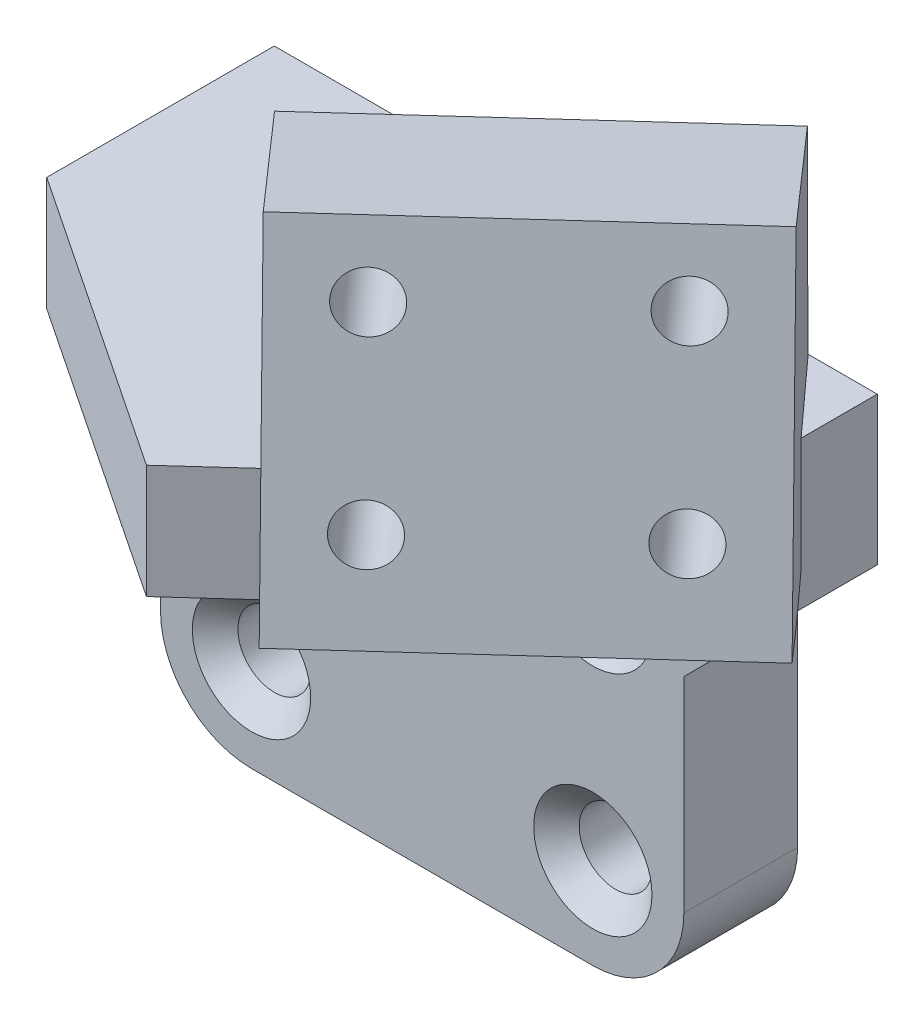
ISO-10303-21;
HEADER;
FILE_DESCRIPTION(('STEP AP214'),'2;1');
FILE_NAME('part.step','',(''),(''),'','','');
FILE_SCHEMA(('AUTOMOTIVE_DESIGN { 1 0 10303 214 1 1 1 1 }'));
ENDSEC;
DATA;
#1=APPLICATION_CONTEXT('core data for automotive mechanical design processes');
#2=APPLICATION_PROTOCOL_DEFINITION('international standard','automotive_design',2000,#1);
#3=PRODUCT_CONTEXT('',#1,'mechanical');
#4=PRODUCT('Part','Part','',(#3));
#5=PRODUCT_RELATED_PRODUCT_CATEGORY('part','',(#4));
#6=PRODUCT_DEFINITION_FORMATION('','',#4);
#7=PRODUCT_DEFINITION_CONTEXT('part definition',#1,'design');
#8=PRODUCT_DEFINITION('design','',#6,#7);
#9=PRODUCT_DEFINITION_SHAPE('','',#8);
#10=(LENGTH_UNIT() NAMED_UNIT(*) SI_UNIT(.MILLI.,.METRE.));
#11=(NAMED_UNIT(*) PLANE_ANGLE_UNIT() SI_UNIT($,.RADIAN.));
#12=(NAMED_UNIT(*) SI_UNIT($,.STERADIAN.) SOLID_ANGLE_UNIT());
#13=UNCERTAINTY_MEASURE_WITH_UNIT(LENGTH_MEASURE(1.E-05),#10,'distance_accuracy_value','');
#14=(GEOMETRIC_REPRESENTATION_CONTEXT(3) GLOBAL_UNCERTAINTY_ASSIGNED_CONTEXT((#13)) GLOBAL_UNIT_ASSIGNED_CONTEXT((#10,
#11,#12)) REPRESENTATION_CONTEXT('',''));
#15=CARTESIAN_POINT('',(0.,0.,0.));
#16=DIRECTION('',(0.,0.,1.));
#17=DIRECTION('',(1.,0.,0.));
#18=AXIS2_PLACEMENT_3D('',#15,#16,#17);
#19=CARTESIAN_POINT('',(0.,14.,0.));
#20=DIRECTION('',(0.,1.,0.));
#21=DIRECTION('',(0.,0.,1.));
#22=AXIS2_PLACEMENT_3D('',#19,#20,#21);
#23=PLANE('',#22);
#24=DIRECTION('',(-0.671979137980562,0.,-0.740570076440374));
#25=VECTOR('',#24,1.);
#26=CARTESIAN_POINT('',(-5.71821437489418,14.,5.18859847119252));
#27=LINE('',#26,#25);
#28=CARTESIAN_POINT('',(4.36147269481426,14.,16.2971496177981));
#29=VERTEX_POINT('',#28);
#30=CARTESIAN_POINT('',(-2.02232911600108,14.,9.2617338916146));
#31=VERTEX_POINT('',#30);
#32=EDGE_CURVE('E58',#29,#31,#27,.T.);
#33=ORIENTED_EDGE('',*,*,#32,.T.);
#34=DIRECTION('',(0.740570076440372,0.,-0.671979137980564));
#35=VECTOR('',#34,1.);
#36=CARTESIAN_POINT('',(10.2563024992818,14.,-1.87966183973595));
#37=LINE('',#36,#35);
#38=CARTESIAN_POINT('',(8.18477790326742,14.,0.));
#39=VERTEX_POINT('',#38);
#40=EDGE_CURVE('E361',#31,#39,#37,.T.);
#41=ORIENTED_EDGE('',*,*,#40,.T.);
#42=DIRECTION('',(-1.,0.,0.));
#43=VECTOR('',#42,1.);
#44=CARTESIAN_POINT('',(-11.5,14.,0.));
#45=LINE('',#44,#43);
#46=CARTESIAN_POINT('',(-11.5,14.,0.));
#47=VERTEX_POINT('',#46);
#48=EDGE_CURVE('E244',#39,#47,#45,.T.);
#49=ORIENTED_EDGE('',*,*,#48,.T.);
#50=DIRECTION('',(0.,0.,1.));
#51=VECTOR('',#50,1.);
#52=CARTESIAN_POINT('',(-11.5,14.,0.));
#53=LINE('',#52,#51);
#54=CARTESIAN_POINT('',(-11.5,14.,10.));
#55=VERTEX_POINT('',#54);
#56=EDGE_CURVE('E236',#47,#55,#53,.T.);
#57=ORIENTED_EDGE('',*,*,#56,.T.);
#58=DIRECTION('',(-0.832050294337844,0.,-0.554700196225229));
#59=VECTOR('',#58,1.);
#60=CARTESIAN_POINT('',(-8.15384615384615,14.,12.2307692307692));
#61=LINE('',#60,#59);
#62=CARTESIAN_POINT('',(1.64416883491799,14.,18.7627792232787));
#63=VERTEX_POINT('',#62);
#64=EDGE_CURVE('E314',#55,#63,#61,.F.);
#65=ORIENTED_EDGE('',*,*,#64,.T.);
#66=DIRECTION('',(0.740570076440372,0.,-0.671979137980564));
#67=VECTOR('',#66,1.);
#68=CARTESIAN_POINT('',(0.280661199928528,14.,20.));
#69=LINE('',#68,#67);
#70=EDGE_CURVE('E239',#63,#29,#69,.T.);
#71=ORIENTED_EDGE('',*,*,#70,.T.);
#72=EDGE_LOOP('',(#33,#41,#49,#57,#65,#71));
#73=FACE_BOUND('',#72,.T.);
#74=ADVANCED_FACE('F36',(#73),#23,.T.);
#75=CARTESIAN_POINT('',(0.280661199928528,14.,20.));
#76=DIRECTION('',(-0.671979137980564,0.,-0.740570076440372));
#77=DIRECTION('',(-0.740570076440372,0.,0.671979137980564));
#78=AXIS2_PLACEMENT_3D('',#75,#76,#77);
#79=PLANE('',#78);
#80=ORIENTED_EDGE('',*,*,#70,.F.);
#81=DIRECTION('',(0.,1.,0.));
#82=VECTOR('',#81,1.);
#83=CARTESIAN_POINT('',(1.64416883491799,14.,18.7627792232787));
#84=LINE('',#83,#82);
#85=CARTESIAN_POINT('',(1.64416883491799,9.,18.7627792232787));
#86=VERTEX_POINT('',#85);
#87=EDGE_CURVE('E307',#63,#86,#84,.F.);
#88=ORIENTED_EDGE('',*,*,#87,.T.);
#89=DIRECTION('',(0.740570076440372,0.,-0.671979137980564));
#90=VECTOR('',#89,1.);
#91=CARTESIAN_POINT('',(0.280661199928528,9.,20.));
#92=LINE('',#91,#90);
#93=CARTESIAN_POINT('',(4.36147269481426,9.,16.2971496177981));
#94=VERTEX_POINT('',#93);
#95=EDGE_CURVE('E240',#86,#94,#92,.T.);
#96=ORIENTED_EDGE('',*,*,#95,.T.);
#97=DIRECTION('',(0.,-1.,0.));
#98=VECTOR('',#97,1.);
#99=CARTESIAN_POINT('',(4.36147269481426,14.,16.2971496177981));
#100=LINE('',#99,#98);
#101=EDGE_CURVE('E231',#29,#94,#100,.T.);
#102=ORIENTED_EDGE('',*,*,#101,.F.);
#103=EDGE_LOOP('',(#80,#88,#96,#102));
#104=FACE_BOUND('',#103,.T.);
#105=ADVANCED_FACE('F433',(#104),#79,.F.);
#106=CARTESIAN_POINT('',(15.,14.,0.));
#107=VERTEX_POINT('',#106);
#108=CARTESIAN_POINT('',(11.9618717397133,14.,0.));
#109=VERTEX_POINT('',#108);
#110=EDGE_CURVE('E245',#107,#109,#45,.T.);
#111=ORIENTED_EDGE('',*,*,#110,.T.);
#112=DIRECTION('',(0.671979137980564,0.,0.740570076440372));
#113=VECTOR('',#112,1.);
#114=CARTESIAN_POINT('',(6.56041724038872,14.,-5.952797260158));
#115=LINE('',#114,#113);
#116=CARTESIAN_POINT('',(15.,14.,3.34823918004016));
#117=VERTEX_POINT('',#116);
#118=EDGE_CURVE('E304',#109,#117,#115,.T.);
#119=ORIENTED_EDGE('',*,*,#118,.T.);
#120=DIRECTION('',(0.,0.,-1.));
#121=VECTOR('',#120,1.);
#122=CARTESIAN_POINT('',(15.,14.,0.));
#123=LINE('',#122,#121);
#124=EDGE_CURVE('E242',#117,#107,#123,.T.);
#125=ORIENTED_EDGE('',*,*,#124,.T.);
#126=EDGE_LOOP('',(#111,#119,#125));
#127=FACE_BOUND('',#126,.T.);
#128=ADVANCED_FACE('F431',(#127),#23,.T.);
#129=CARTESIAN_POINT('',(0.,0.,5.));
#130=DIRECTION('',(0.,0.,1.));
#131=DIRECTION('',(1.,0.,0.));
#132=AXIS2_PLACEMENT_3D('',#129,#130,#131);
#133=PLANE('',#132);
#134=CARTESIAN_POINT('',(-7.5,-5.,5.));
#135=DIRECTION('',(0.,0.,1.));
#136=DIRECTION('',(1.,0.,0.));
#137=AXIS2_PLACEMENT_3D('',#134,#135,#136);
#138=CIRCLE('',#137,2.6);
#139=CARTESIAN_POINT('',(-4.9,-5.,5.));
#140=VERTEX_POINT('',#139);
#141=EDGE_CURVE('E346',#140,#140,#138,.F.);
#142=ORIENTED_EDGE('',*,*,#141,.T.);
#143=EDGE_LOOP('',(#142));
#144=FACE_BOUND('',#143,.T.);
#145=CARTESIAN_POINT('',(7.5,-5.,5.));
#146=DIRECTION('',(0.,0.,1.));
#147=DIRECTION('',(1.,0.,0.));
#148=AXIS2_PLACEMENT_3D('',#145,#146,#147);
#149=CIRCLE('',#148,2.6);
#150=CARTESIAN_POINT('',(10.1,-5.,5.));
#151=VERTEX_POINT('',#150);
#152=EDGE_CURVE('E343',#151,#151,#149,.F.);
#153=ORIENTED_EDGE('',*,*,#152,.T.);
#154=EDGE_LOOP('',(#153));
#155=FACE_BOUND('',#154,.T.);
#156=CARTESIAN_POINT('',(7.5,5.,5.));
#157=DIRECTION('',(0.,0.,1.));
#158=DIRECTION('',(1.,0.,0.));
#159=AXIS2_PLACEMENT_3D('',#156,#157,#158);
#160=CIRCLE('',#159,2.6);
#161=CARTESIAN_POINT('',(10.1,5.,5.));
#162=VERTEX_POINT('',#161);
#163=EDGE_CURVE('E340',#162,#162,#160,.F.);
#164=ORIENTED_EDGE('',*,*,#163,.T.);
#165=EDGE_LOOP('',(#164));
#166=FACE_BOUND('',#165,.T.);
#167=CARTESIAN_POINT('',(-7.5,5.,5.));
#168=DIRECTION('',(0.,0.,1.));
#169=DIRECTION('',(1.,0.,0.));
#170=AXIS2_PLACEMENT_3D('',#167,#168,#169);
#171=CIRCLE('',#170,2.60000000000001);
#172=CARTESIAN_POINT('',(-4.89999999999999,5.,5.));
#173=VERTEX_POINT('',#172);
#174=EDGE_CURVE('E337',#173,#173,#171,.F.);
#175=ORIENTED_EDGE('',*,*,#174,.T.);
#176=EDGE_LOOP('',(#175));
#177=FACE_BOUND('',#176,.T.);
#178=DIRECTION('',(1.,0.,0.));
#179=VECTOR('',#178,1.);
#180=CARTESIAN_POINT('',(11.5,-9.,5.));
#181=LINE('',#180,#179);
#182=CARTESIAN_POINT('',(-7.5,-9.,5.));
#183=VERTEX_POINT('',#182);
#184=CARTESIAN_POINT('',(7.5,-9.,5.));
#185=VERTEX_POINT('',#184);
#186=EDGE_CURVE('E269',#183,#185,#181,.T.);
#187=ORIENTED_EDGE('',*,*,#186,.T.);
#188=CARTESIAN_POINT('',(7.5,-5.,5.));
#189=DIRECTION('',(0.,0.,1.));
#190=DIRECTION('',(1.,0.,0.));
#191=AXIS2_PLACEMENT_3D('',#188,#189,#190);
#192=CIRCLE('',#191,4.);
#193=CARTESIAN_POINT('',(11.5,-5.,5.));
#194=VERTEX_POINT('',#193);
#195=EDGE_CURVE('E330',#185,#194,#192,.T.);
#196=ORIENTED_EDGE('',*,*,#195,.T.);
#197=DIRECTION('',(0.,1.,0.));
#198=VECTOR('',#197,1.);
#199=CARTESIAN_POINT('',(11.5,-9.,5.));
#200=LINE('',#199,#198);
#201=CARTESIAN_POINT('',(11.5,3.99999999999997,5.));
#202=VERTEX_POINT('',#201);
#203=EDGE_CURVE('E273',#194,#202,#200,.T.);
#204=ORIENTED_EDGE('',*,*,#203,.T.);
#205=DIRECTION('',(-0.707106781186551,-0.707106781186544,0.));
#206=VECTOR('',#205,1.);
#207=CARTESIAN_POINT('',(16.5000000000001,9.,5.));
#208=LINE('',#207,#206);
#209=CARTESIAN_POINT('',(15.,7.49999999999993,5.));
#210=VERTEX_POINT('',#209);
#211=EDGE_CURVE('E290',#202,#210,#208,.F.);
#212=ORIENTED_EDGE('',*,*,#211,.T.);
#213=DIRECTION('',(0.,-1.,0.));
#214=VECTOR('',#213,1.);
#215=CARTESIAN_POINT('',(15.,0.,5.));
#216=LINE('',#215,#214);
#217=CARTESIAN_POINT('',(15.,8.,5.));
#218=VERTEX_POINT('',#217);
#219=EDGE_CURVE('E293',#218,#210,#216,.T.);
#220=ORIENTED_EDGE('',*,*,#219,.F.);
#221=DIRECTION('',(-1.,0.,0.));
#222=VECTOR('',#221,1.);
#223=CARTESIAN_POINT('',(0.,8.,5.));
#224=LINE('',#223,#222);
#225=CARTESIAN_POINT('',(-11.5,8.,5.));
#226=VERTEX_POINT('',#225);
#227=EDGE_CURVE('E295',#218,#226,#224,.T.);
#228=ORIENTED_EDGE('',*,*,#227,.T.);
#229=DIRECTION('',(0.,-1.,0.));
#230=VECTOR('',#229,1.);
#231=CARTESIAN_POINT('',(-11.5,-9.,5.));
#232=LINE('',#231,#230);
#233=CARTESIAN_POINT('',(-11.5,-5.,5.));
#234=VERTEX_POINT('',#233);
#235=EDGE_CURVE('E266',#226,#234,#232,.T.);
#236=ORIENTED_EDGE('',*,*,#235,.T.);
#237=CARTESIAN_POINT('',(-7.5,-5.,5.));
#238=DIRECTION('',(0.,0.,1.));
#239=DIRECTION('',(1.,0.,0.));
#240=AXIS2_PLACEMENT_3D('',#237,#238,#239);
#241=CIRCLE('',#240,4.);
#242=EDGE_CURVE('E328',#234,#183,#241,.T.);
#243=ORIENTED_EDGE('',*,*,#242,.T.);
#244=EDGE_LOOP('',(#187,#196,#204,#212,#220,#228,#236,#243));
#245=FACE_BOUND('',#244,.T.);
#246=ADVANCED_FACE('F397',(#144,#155,#166,#177,#245),#133,.T.);
#247=CARTESIAN_POINT('',(0.,0.,0.));
#248=DIRECTION('',(0.,0.,1.));
#249=DIRECTION('',(1.,0.,0.));
#250=AXIS2_PLACEMENT_3D('',#247,#248,#249);
#251=PLANE('',#250);
#252=DIRECTION('',(0.,1.,0.));
#253=VECTOR('',#252,1.);
#254=CARTESIAN_POINT('',(11.5,-9.,0.));
#255=LINE('',#254,#253);
#256=CARTESIAN_POINT('',(11.5,-5.,0.));
#257=VERTEX_POINT('',#256);
#258=CARTESIAN_POINT('',(11.5,3.99999999999997,0.));
#259=VERTEX_POINT('',#258);
#260=EDGE_CURVE('E270',#257,#259,#255,.T.);
#261=ORIENTED_EDGE('',*,*,#260,.F.);
#262=CARTESIAN_POINT('',(7.5,-5.,0.));
#263=DIRECTION('',(0.,0.,1.));
#264=DIRECTION('',(1.,0.,0.));
#265=AXIS2_PLACEMENT_3D('',#262,#263,#264);
#266=CIRCLE('',#265,4.);
#267=CARTESIAN_POINT('',(7.5,-9.,0.));
#268=VERTEX_POINT('',#267);
#269=EDGE_CURVE('E321',#257,#268,#266,.F.);
#270=ORIENTED_EDGE('',*,*,#269,.T.);
#271=DIRECTION('',(1.,0.,0.));
#272=VECTOR('',#271,1.);
#273=CARTESIAN_POINT('',(11.5,-9.,0.));
#274=LINE('',#273,#272);
#275=CARTESIAN_POINT('',(-7.5,-9.,0.));
#276=VERTEX_POINT('',#275);
#277=EDGE_CURVE('E278',#276,#268,#274,.T.);
#278=ORIENTED_EDGE('',*,*,#277,.F.);
#279=CARTESIAN_POINT('',(-7.5,-5.,0.));
#280=DIRECTION('',(0.,0.,1.));
#281=DIRECTION('',(1.,0.,0.));
#282=AXIS2_PLACEMENT_3D('',#279,#280,#281);
#283=CIRCLE('',#282,4.);
#284=CARTESIAN_POINT('',(-11.5,-5.,0.));
#285=VERTEX_POINT('',#284);
#286=EDGE_CURVE('E319',#276,#285,#283,.F.);
#287=ORIENTED_EDGE('',*,*,#286,.T.);
#288=DIRECTION('',(0.,-1.,0.));
#289=VECTOR('',#288,1.);
#290=CARTESIAN_POINT('',(-11.5,-9.,0.));
#291=LINE('',#290,#289);
#292=EDGE_CURVE('E265',#47,#285,#291,.T.);
#293=ORIENTED_EDGE('',*,*,#292,.F.);
#294=ORIENTED_EDGE('',*,*,#48,.F.);
#295=DIRECTION('',(-0.830009585778001,-0.557749125966712,0.));
#296=VECTOR('',#295,1.);
#297=CARTESIAN_POINT('',(-3.93496552859919,5.85578525610859,0.));
#298=LINE('',#297,#296);
#299=CARTESIAN_POINT('',(11.9618717397133,16.5381282602867,0.));
#300=VERTEX_POINT('',#299);
#301=EDGE_CURVE('E51',#39,#300,#298,.F.);
#302=ORIENTED_EDGE('',*,*,#301,.T.);
#303=DIRECTION('',(0.,-1.,0.));
#304=VECTOR('',#303,1.);
#305=CARTESIAN_POINT('',(11.9618717397134,0.,0.));
#306=LINE('',#305,#304);
#307=EDGE_CURVE('E11',#109,#300,#306,.F.);
#308=ORIENTED_EDGE('',*,*,#307,.F.);
#309=ORIENTED_EDGE('',*,*,#110,.F.);
#310=DIRECTION('',(0.,-1.,0.));
#311=VECTOR('',#310,1.);
#312=CARTESIAN_POINT('',(15.,14.,0.));
#313=LINE('',#312,#311);
#314=CARTESIAN_POINT('',(15.,7.49999999999993,0.));
#315=VERTEX_POINT('',#314);
#316=EDGE_CURVE('E248',#107,#315,#313,.T.);
#317=ORIENTED_EDGE('',*,*,#316,.T.);
#318=DIRECTION('',(0.707106781186551,0.707106781186544,0.));
#319=VECTOR('',#318,1.);
#320=CARTESIAN_POINT('',(3.74999999999996,-3.75,0.));
#321=LINE('',#320,#319);
#322=EDGE_CURVE('E287',#315,#259,#321,.F.);
#323=ORIENTED_EDGE('',*,*,#322,.T.);
#324=EDGE_LOOP('',(#261,#270,#278,#287,#293,#294,#302,#308,#309,#317,#323));
#325=FACE_BOUND('',#324,.T.);
#326=CARTESIAN_POINT('',(-7.5,5.,0.));
#327=DIRECTION('',(0.,0.,1.));
#328=DIRECTION('',(1.,0.,0.));
#329=AXIS2_PLACEMENT_3D('',#326,#327,#328);
#330=CIRCLE('',#329,1.6);
#331=CARTESIAN_POINT('',(-5.9,5.,0.));
#332=VERTEX_POINT('',#331);
#333=EDGE_CURVE('E262',#332,#332,#330,.T.);
#334=ORIENTED_EDGE('',*,*,#333,.T.);
#335=EDGE_LOOP('',(#334));
#336=FACE_BOUND('',#335,.T.);
#337=CARTESIAN_POINT('',(7.5,5.,0.));
#338=DIRECTION('',(0.,0.,1.));
#339=DIRECTION('',(1.,0.,0.));
#340=AXIS2_PLACEMENT_3D('',#337,#338,#339);
#341=CIRCLE('',#340,1.6);
#342=CARTESIAN_POINT('',(9.1,5.,0.));
#343=VERTEX_POINT('',#342);
#344=EDGE_CURVE('E259',#343,#343,#341,.T.);
#345=ORIENTED_EDGE('',*,*,#344,.T.);
#346=EDGE_LOOP('',(#345));
#347=FACE_BOUND('',#346,.T.);
#348=CARTESIAN_POINT('',(7.5,-5.,0.));
#349=DIRECTION('',(0.,0.,1.));
#350=DIRECTION('',(1.,0.,0.));
#351=AXIS2_PLACEMENT_3D('',#348,#349,#350);
#352=CIRCLE('',#351,1.6);
#353=CARTESIAN_POINT('',(9.1,-5.,0.));
#354=VERTEX_POINT('',#353);
#355=EDGE_CURVE('E256',#354,#354,#352,.T.);
#356=ORIENTED_EDGE('',*,*,#355,.T.);
#357=EDGE_LOOP('',(#356));
#358=FACE_BOUND('',#357,.T.);
#359=CARTESIAN_POINT('',(-7.5,-5.,0.));
#360=DIRECTION('',(0.,0.,1.));
#361=DIRECTION('',(1.,0.,0.));
#362=AXIS2_PLACEMENT_3D('',#359,#360,#361);
#363=CIRCLE('',#362,1.6);
#364=CARTESIAN_POINT('',(-5.9,-5.,0.));
#365=VERTEX_POINT('',#364);
#366=EDGE_CURVE('E253',#365,#365,#363,.T.);
#367=ORIENTED_EDGE('',*,*,#366,.T.);
#368=EDGE_LOOP('',(#367));
#369=FACE_BOUND('',#368,.T.);
#370=ADVANCED_FACE('F428',(#325,#336,#347,#358,#369),#251,.F.);
#371=CARTESIAN_POINT('',(-11.5,-9.,5.));
#372=DIRECTION('',(1.,0.,0.));
#373=DIRECTION('',(0.,0.,-1.));
#374=AXIS2_PLACEMENT_3D('',#371,#372,#373);
#375=PLANE('',#374);
#376=ORIENTED_EDGE('',*,*,#292,.T.);
#377=DIRECTION('',(0.,0.,-1.));
#378=VECTOR('',#377,1.);
#379=CARTESIAN_POINT('',(-11.5,-5.,5.));
#380=LINE('',#379,#378);
#381=EDGE_CURVE('E332',#285,#234,#380,.F.);
#382=ORIENTED_EDGE('',*,*,#381,.T.);
#383=ORIENTED_EDGE('',*,*,#235,.F.);
#384=DIRECTION('',(0.,0.70710678118655,0.707106781186545));
#385=VECTOR('',#384,1.);
#386=CARTESIAN_POINT('',(-11.5,-0.500000000000059,-3.5));
#387=LINE('',#386,#385);
#388=CARTESIAN_POINT('',(-11.5,9.,6.));
#389=VERTEX_POINT('',#388);
#390=EDGE_CURVE('E300',#226,#389,#387,.T.);
#391=ORIENTED_EDGE('',*,*,#390,.T.);
#392=DIRECTION('',(0.,0.,1.));
#393=VECTOR('',#392,1.);
#394=CARTESIAN_POINT('',(-11.5,9.,0.));
#395=LINE('',#394,#393);
#396=CARTESIAN_POINT('',(-11.5,9.,10.));
#397=VERTEX_POINT('',#396);
#398=EDGE_CURVE('E235',#389,#397,#395,.T.);
#399=ORIENTED_EDGE('',*,*,#398,.T.);
#400=DIRECTION('',(0.,1.,0.));
#401=VECTOR('',#400,1.);
#402=CARTESIAN_POINT('',(-11.5,-9.,10.));
#403=LINE('',#402,#401);
#404=EDGE_CURVE('E311',#397,#55,#403,.T.);
#405=ORIENTED_EDGE('',*,*,#404,.T.);
#406=ORIENTED_EDGE('',*,*,#56,.F.);
#407=EDGE_LOOP('',(#376,#382,#383,#391,#399,#405,#406));
#408=FACE_BOUND('',#407,.T.);
#409=ADVANCED_FACE('F400',(#408),#375,.F.);
#410=CARTESIAN_POINT('',(11.5,-9.,5.));
#411=DIRECTION('',(0.,1.,0.));
#412=DIRECTION('',(0.,0.,1.));
#413=AXIS2_PLACEMENT_3D('',#410,#411,#412);
#414=PLANE('',#413);
#415=ORIENTED_EDGE('',*,*,#277,.T.);
#416=DIRECTION('',(0.,0.,-1.));
#417=VECTOR('',#416,1.);
#418=CARTESIAN_POINT('',(7.5,-9.,5.));
#419=LINE('',#418,#417);
#420=EDGE_CURVE('E326',#268,#185,#419,.F.);
#421=ORIENTED_EDGE('',*,*,#420,.T.);
#422=ORIENTED_EDGE('',*,*,#186,.F.);
#423=DIRECTION('',(0.,0.,-1.));
#424=VECTOR('',#423,1.);
#425=CARTESIAN_POINT('',(-7.5,-9.,5.));
#426=LINE('',#425,#424);
#427=EDGE_CURVE('E323',#183,#276,#426,.T.);
#428=ORIENTED_EDGE('',*,*,#427,.T.);
#429=EDGE_LOOP('',(#415,#421,#422,#428));
#430=FACE_BOUND('',#429,.T.);
#431=ADVANCED_FACE('F410',(#430),#414,.F.);
#432=CARTESIAN_POINT('',(11.5,-9.,5.));
#433=DIRECTION('',(-1.,0.,0.));
#434=DIRECTION('',(0.,0.,1.));
#435=AXIS2_PLACEMENT_3D('',#432,#433,#434);
#436=PLANE('',#435);
#437=ORIENTED_EDGE('',*,*,#203,.F.);
#438=DIRECTION('',(0.,0.,-1.));
#439=VECTOR('',#438,1.);
#440=CARTESIAN_POINT('',(11.5,-5.,5.));
#441=LINE('',#440,#439);
#442=EDGE_CURVE('E316',#194,#257,#441,.T.);
#443=ORIENTED_EDGE('',*,*,#442,.T.);
#444=ORIENTED_EDGE('',*,*,#260,.T.);
#445=DIRECTION('',(0.,0.,1.));
#446=VECTOR('',#445,1.);
#447=CARTESIAN_POINT('',(11.5,3.99999999999997,5.));
#448=LINE('',#447,#446);
#449=EDGE_CURVE('E275',#259,#202,#448,.T.);
#450=ORIENTED_EDGE('',*,*,#449,.T.);
#451=EDGE_LOOP('',(#437,#443,#444,#450));
#452=FACE_BOUND('',#451,.T.);
#453=ADVANCED_FACE('F419',(#452),#436,.F.);
#454=CARTESIAN_POINT('',(-7.5,5.,5.));
#455=DIRECTION('',(0.,0.,-1.));
#456=DIRECTION('',(-1.,0.,0.));
#457=AXIS2_PLACEMENT_3D('',#454,#455,#456);
#458=CYLINDRICAL_SURFACE('',#457,1.6);
#459=CARTESIAN_POINT('',(-7.5,5.,3.99999999999999));
#460=DIRECTION('',(0.,0.,1.));
#461=DIRECTION('',(1.,0.,0.));
#462=AXIS2_PLACEMENT_3D('',#459,#460,#461);
#463=CIRCLE('',#462,1.6);
#464=CARTESIAN_POINT('',(-5.9,5.,3.99999999999999));
#465=VERTEX_POINT('',#464);
#466=EDGE_CURVE('E355',#465,#465,#463,.T.);
#467=ORIENTED_EDGE('',*,*,#466,.T.);
#468=EDGE_LOOP('',(#467));
#469=FACE_BOUND('',#468,.T.);
#470=ORIENTED_EDGE('',*,*,#333,.F.);
#471=EDGE_LOOP('',(#470));
#472=FACE_BOUND('',#471,.T.);
#473=ADVANCED_FACE('F514',(#469,#472),#458,.F.);
#474=CARTESIAN_POINT('',(7.5,5.,5.));
#475=DIRECTION('',(0.,0.,-1.));
#476=DIRECTION('',(-1.,0.,0.));
#477=AXIS2_PLACEMENT_3D('',#474,#475,#476);
#478=CYLINDRICAL_SURFACE('',#477,1.6);
#479=CARTESIAN_POINT('',(7.5,5.,4.00000000000001));
#480=DIRECTION('',(0.,0.,1.));
#481=DIRECTION('',(1.,0.,0.));
#482=AXIS2_PLACEMENT_3D('',#479,#480,#481);
#483=CIRCLE('',#482,1.6);
#484=CARTESIAN_POINT('',(9.1,5.,4.00000000000001));
#485=VERTEX_POINT('',#484);
#486=EDGE_CURVE('E352',#485,#485,#483,.T.);
#487=ORIENTED_EDGE('',*,*,#486,.T.);
#488=EDGE_LOOP('',(#487));
#489=FACE_BOUND('',#488,.T.);
#490=ORIENTED_EDGE('',*,*,#344,.F.);
#491=EDGE_LOOP('',(#490));
#492=FACE_BOUND('',#491,.T.);
#493=ADVANCED_FACE('F547',(#489,#492),#478,.F.);
#494=CARTESIAN_POINT('',(7.5,-5.,5.));
#495=DIRECTION('',(0.,0.,-1.));
#496=DIRECTION('',(-1.,0.,0.));
#497=AXIS2_PLACEMENT_3D('',#494,#495,#496);
#498=CYLINDRICAL_SURFACE('',#497,1.6);
#499=CARTESIAN_POINT('',(7.5,-5.,4.00000000000001));
#500=DIRECTION('',(0.,0.,1.));
#501=DIRECTION('',(1.,0.,0.));
#502=AXIS2_PLACEMENT_3D('',#499,#500,#501);
#503=CIRCLE('',#502,1.6);
#504=CARTESIAN_POINT('',(9.1,-5.,4.00000000000001));
#505=VERTEX_POINT('',#504);
#506=EDGE_CURVE('E349',#505,#505,#503,.T.);
#507=ORIENTED_EDGE('',*,*,#506,.T.);
#508=EDGE_LOOP('',(#507));
#509=FACE_BOUND('',#508,.T.);
#510=ORIENTED_EDGE('',*,*,#355,.F.);
#511=EDGE_LOOP('',(#510));
#512=FACE_BOUND('',#511,.T.);
#513=ADVANCED_FACE('F557',(#509,#512),#498,.F.);
#514=CARTESIAN_POINT('',(-7.5,-5.,5.));
#515=DIRECTION('',(0.,0.,-1.));
#516=DIRECTION('',(-1.,0.,0.));
#517=AXIS2_PLACEMENT_3D('',#514,#515,#516);
#518=CYLINDRICAL_SURFACE('',#517,1.6);
#519=CARTESIAN_POINT('',(-7.5,-5.,4.));
#520=DIRECTION('',(0.,0.,1.));
#521=DIRECTION('',(1.,0.,0.));
#522=AXIS2_PLACEMENT_3D('',#519,#520,#521);
#523=CIRCLE('',#522,1.6);
#524=CARTESIAN_POINT('',(-5.9,-5.,4.));
#525=VERTEX_POINT('',#524);
#526=EDGE_CURVE('E334',#525,#525,#523,.T.);
#527=ORIENTED_EDGE('',*,*,#526,.T.);
#528=EDGE_LOOP('',(#527));
#529=FACE_BOUND('',#528,.T.);
#530=ORIENTED_EDGE('',*,*,#366,.F.);
#531=EDGE_LOOP('',(#530));
#532=FACE_BOUND('',#531,.T.);
#533=ADVANCED_FACE('F567',(#529,#532),#518,.F.);
#534=CARTESIAN_POINT('',(15.,14.,0.));
#535=DIRECTION('',(-1.,0.,0.));
#536=DIRECTION('',(0.,0.,1.));
#537=AXIS2_PLACEMENT_3D('',#534,#535,#536);
#538=PLANE('',#537);
#539=DIRECTION('',(0.,1.,0.));
#540=VECTOR('',#539,1.);
#541=CARTESIAN_POINT('',(15.,14.,3.34823918004016));
#542=LINE('',#541,#540);
#543=CARTESIAN_POINT('',(15.,9.,3.34823918004016));
#544=VERTEX_POINT('',#543);
#545=EDGE_CURVE('E233',#544,#117,#542,.T.);
#546=ORIENTED_EDGE('',*,*,#545,.F.);
#547=DIRECTION('',(0.,0.,1.));
#548=VECTOR('',#547,1.);
#549=CARTESIAN_POINT('',(15.,9.,0.));
#550=LINE('',#549,#548);
#551=CARTESIAN_POINT('',(15.,9.,6.));
#552=VERTEX_POINT('',#551);
#553=EDGE_CURVE('E227',#544,#552,#550,.T.);
#554=ORIENTED_EDGE('',*,*,#553,.T.);
#555=DIRECTION('',(0.,-0.70710678118655,-0.707106781186545));
#556=VECTOR('',#555,1.);
#557=CARTESIAN_POINT('',(15.,8.50000000000002,5.50000000000002));
#558=LINE('',#557,#556);
#559=EDGE_CURVE('E302',#552,#218,#558,.T.);
#560=ORIENTED_EDGE('',*,*,#559,.T.);
#561=ORIENTED_EDGE('',*,*,#219,.T.);
#562=DIRECTION('',(0.,0.,1.));
#563=VECTOR('',#562,1.);
#564=CARTESIAN_POINT('',(15.,7.49999999999993,0.));
#565=LINE('',#564,#563);
#566=EDGE_CURVE('E284',#210,#315,#565,.F.);
#567=ORIENTED_EDGE('',*,*,#566,.T.);
#568=ORIENTED_EDGE('',*,*,#316,.F.);
#569=ORIENTED_EDGE('',*,*,#124,.F.);
#570=EDGE_LOOP('',(#546,#554,#560,#561,#567,#568,#569));
#571=FACE_BOUND('',#570,.T.);
#572=ADVANCED_FACE('F389',(#571),#538,.F.);
#573=CARTESIAN_POINT('',(0.,9.,0.));
#574=DIRECTION('',(0.,1.,0.));
#575=DIRECTION('',(0.,0.,1.));
#576=AXIS2_PLACEMENT_3D('',#573,#574,#575);
#577=PLANE('',#576);
#578=ORIENTED_EDGE('',*,*,#95,.F.);
#579=DIRECTION('',(0.832050294337844,0.,0.554700196225229));
#580=VECTOR('',#579,1.);
#581=CARTESIAN_POINT('',(3.5,9.,20.));
#582=LINE('',#581,#580);
#583=EDGE_CURVE('E309',#86,#397,#582,.F.);
#584=ORIENTED_EDGE('',*,*,#583,.T.);
#585=ORIENTED_EDGE('',*,*,#398,.F.);
#586=DIRECTION('',(1.,0.,0.));
#587=VECTOR('',#586,1.);
#588=CARTESIAN_POINT('',(0.,9.,6.));
#589=LINE('',#588,#587);
#590=EDGE_CURVE('E298',#389,#552,#589,.T.);
#591=ORIENTED_EDGE('',*,*,#590,.T.);
#592=ORIENTED_EDGE('',*,*,#553,.F.);
#593=DIRECTION('',(-0.671979137980564,0.,-0.740570076440372));
#594=VECTOR('',#593,1.);
#595=CARTESIAN_POINT('',(12.2722399132235,9.,0.342048389585162));
#596=LINE('',#595,#594);
#597=CARTESIAN_POINT('',(16.9340570935933,9.,5.47971131762284));
#598=VERTEX_POINT('',#597);
#599=EDGE_CURVE('E212',#598,#544,#596,.T.);
#600=ORIENTED_EDGE('',*,*,#599,.F.);
#601=DIRECTION('',(-0.740570076440372,0.,0.671979137980564));
#602=VECTOR('',#601,1.);
#603=CARTESIAN_POINT('',(29.4328314572911,9.,-5.86143773757735));
#604=LINE('',#603,#602);
#605=CARTESIAN_POINT('',(4.65542547831034,9.,16.6211070489734));
#606=VERTEX_POINT('',#605);
#607=EDGE_CURVE('E213',#598,#606,#604,.T.);
#608=ORIENTED_EDGE('',*,*,#607,.T.);
#609=DIRECTION('',(0.671979137980564,0.,0.740570076440372));
#610=VECTOR('',#609,1.);
#611=CARTESIAN_POINT('',(-0.00639170205940596,9.,11.4834441209357));
#612=LINE('',#611,#610);
#613=EDGE_CURVE('E181',#94,#606,#612,.T.);
#614=ORIENTED_EDGE('',*,*,#613,.F.);
#615=EDGE_LOOP('',(#578,#584,#585,#591,#592,#600,#608,#614));
#616=FACE_BOUND('',#615,.T.);
#617=ADVANCED_FACE('F384',(#616),#577,.F.);
#618=CARTESIAN_POINT('',(16.5000000000001,9.,0.));
#619=DIRECTION('',(0.707106781186544,-0.707106781186551,0.));
#620=DIRECTION('',(0.,0.,1.));
#621=AXIS2_PLACEMENT_3D('',#618,#619,#620);
#622=PLANE('',#621);
#623=ORIENTED_EDGE('',*,*,#211,.F.);
#624=ORIENTED_EDGE('',*,*,#449,.F.);
#625=ORIENTED_EDGE('',*,*,#322,.F.);
#626=ORIENTED_EDGE('',*,*,#566,.F.);
#627=EDGE_LOOP('',(#623,#624,#625,#626));
#628=FACE_BOUND('',#627,.T.);
#629=ADVANCED_FACE('F424',(#628),#622,.T.);
#630=CARTESIAN_POINT('',(0.,8.,5.));
#631=DIRECTION('',(0.,0.707106781186545,-0.70710678118655));
#632=DIRECTION('',(-1.,0.,0.));
#633=AXIS2_PLACEMENT_3D('',#630,#631,#632);
#634=PLANE('',#633);
#635=ORIENTED_EDGE('',*,*,#559,.F.);
#636=ORIENTED_EDGE('',*,*,#590,.F.);
#637=ORIENTED_EDGE('',*,*,#390,.F.);
#638=ORIENTED_EDGE('',*,*,#227,.F.);
#639=EDGE_LOOP('',(#635,#636,#637,#638));
#640=FACE_BOUND('',#639,.T.);
#641=ADVANCED_FACE('F394',(#640),#634,.F.);
#642=CARTESIAN_POINT('',(17.1276504450563,24.2821979742894,5.69306532668062));
#643=DIRECTION('',(-0.740570076440372,0.,0.671979137980564));
#644=DIRECTION('',(0.671979137980564,0.,0.740570076440372));
#645=AXIS2_PLACEMENT_3D('',#642,#643,#644);
#646=PLANE('',#645);
#647=DIRECTION('',(-0.66177026494572,-0.173648177666927,-0.729319152927322));
#648=VECTOR('',#647,1.);
#649=CARTESIAN_POINT('',(17.5544292062726,9.16278532377243,6.16340668395388));
#650=LINE('',#649,#648);
#651=CARTESIAN_POINT('',(18.8779697361641,9.51008167910628,7.62204498980853));
#652=VERTEX_POINT('',#651);
#653=EDGE_CURVE('E190',#652,#598,#650,.T.);
#654=ORIENTED_EDGE('',*,*,#653,.T.);
#655=ORIENTED_EDGE('',*,*,#599,.T.);
#656=ORIENTED_EDGE('',*,*,#545,.T.);
#657=ORIENTED_EDGE('',*,*,#118,.F.);
#658=ORIENTED_EDGE('',*,*,#307,.T.);
#659=DIRECTION('',(-0.475161005281945,-0.707106781186551,-0.523662122994824));
#660=VECTOR('',#659,1.);
#661=CARTESIAN_POINT('',(17.1466877378233,24.2538677900754,5.71404581336957));
#662=LINE('',#661,#660);
#663=CARTESIAN_POINT('',(12.2722399132235,17.,0.342048389585164));
#664=VERTEX_POINT('',#663);
#665=EDGE_CURVE('E44',#300,#664,#662,.F.);
#666=ORIENTED_EDGE('',*,*,#665,.T.);
#667=DIRECTION('',(0.,1.,0.));
#668=VECTOR('',#667,1.);
#669=CARTESIAN_POINT('',(12.2722399132235,23.0081407442524,0.342048389585164));
#670=LINE('',#669,#668);
#671=CARTESIAN_POINT('',(12.2722399132235,23.0081407442524,0.342048389585166));
#672=VERTEX_POINT('',#671);
#673=EDGE_CURVE('E210',#664,#672,#670,.T.);
#674=ORIENTED_EDGE('',*,*,#673,.T.);
#675=DIRECTION('',(0.66177026494572,0.173648177666928,0.729319152927322));
#676=VECTOR('',#675,1.);
#677=CARTESIAN_POINT('',(15.473224782692,23.8480775301221,3.86976744436231));
#678=LINE('',#677,#676);
#679=CARTESIAN_POINT('',(17.1276504450563,24.2821979742894,5.69306532668062));
#680=VERTEX_POINT('',#679);
#681=EDGE_CURVE('E217',#672,#680,#678,.T.);
#682=ORIENTED_EDGE('',*,*,#681,.T.);
#683=DIRECTION('',(-0.116687952740518,0.984807753012208,-0.128598644208528));
#684=VECTOR('',#683,1.);
#685=CARTESIAN_POINT('',(17.1276504450563,24.2821979742894,5.69306532668062));
#686=LINE('',#685,#684);
#687=EDGE_CURVE('E194',#652,#680,#686,.T.);
#688=ORIENTED_EDGE('',*,*,#687,.F.);
#689=EDGE_LOOP('',(#654,#655,#656,#657,#658,#666,#674,#682,#688));
#690=FACE_BOUND('',#689,.T.);
#691=ADVANCED_FACE('F368',(#690),#646,.F.);
#692=CARTESIAN_POINT('',(-5.71821437489418,0.,5.18859847119252));
#693=DIRECTION('',(0.740570076440374,0.,-0.671979137980562));
#694=DIRECTION('',(-0.671979137980562,0.,-0.740570076440374));
#695=AXIS2_PLACEMENT_3D('',#692,#693,#694);
#696=PLANE('',#695);
#697=DIRECTION('',(-0.66177026494572,-0.173648177666928,-0.729319152927322));
#698=VECTOR('',#697,1.);
#699=CARTESIAN_POINT('',(3.19459316740909,23.8480775301221,15.0111631757129));
#700=LINE('',#699,#698);
#701=CARTESIAN_POINT('',(4.84901882977339,24.2821979742894,16.8344610580312));
#702=VERTEX_POINT('',#701);
#703=CARTESIAN_POINT('',(-0.00639170205940596,23.0081407442524,11.4834441209357));
#704=VERTEX_POINT('',#703);
#705=EDGE_CURVE('E209',#702,#704,#700,.T.);
#706=ORIENTED_EDGE('',*,*,#705,.T.);
#707=DIRECTION('',(0.,-1.,0.));
#708=VECTOR('',#707,1.);
#709=CARTESIAN_POINT('',(-0.00639170205940596,23.0081407442524,11.4834441209357));
#710=LINE('',#709,#708);
#711=CARTESIAN_POINT('',(-0.00639170205940596,17.,11.4834441209357));
#712=VERTEX_POINT('',#711);
#713=EDGE_CURVE('E219',#704,#712,#710,.T.);
#714=ORIENTED_EDGE('',*,*,#713,.T.);
#715=DIRECTION('',(0.475161005281943,0.707106781186551,0.523662122994825));
#716=VECTOR('',#715,1.);
#717=CARTESIAN_POINT('',(-8.57412571131154,4.24999999999991,2.04117564632096));
#718=LINE('',#717,#716);
#719=EDGE_CURVE('E363',#712,#31,#718,.F.);
#720=ORIENTED_EDGE('',*,*,#719,.T.);
#721=ORIENTED_EDGE('',*,*,#32,.F.);
#722=ORIENTED_EDGE('',*,*,#101,.T.);
#723=ORIENTED_EDGE('',*,*,#613,.T.);
#724=DIRECTION('',(0.66177026494572,0.173648177666927,0.729319152927322));
#725=VECTOR('',#724,1.);
#726=CARTESIAN_POINT('',(5.27579759098971,9.16278532377243,17.3048024153044));
#727=LINE('',#726,#725);
#728=CARTESIAN_POINT('',(6.59933812088115,9.51008167910628,18.7634407211591));
#729=VERTEX_POINT('',#728);
#730=EDGE_CURVE('E174',#606,#729,#727,.T.);
#731=ORIENTED_EDGE('',*,*,#730,.T.);
#732=DIRECTION('',(0.116687952740518,-0.984807753012208,0.128598644208528));
#733=VECTOR('',#732,1.);
#734=CARTESIAN_POINT('',(4.84901882977339,24.2821979742894,16.8344610580312));
#735=LINE('',#734,#733);
#736=EDGE_CURVE('E178',#702,#729,#735,.T.);
#737=ORIENTED_EDGE('',*,*,#736,.F.);
#738=EDGE_LOOP('',(#706,#714,#720,#721,#722,#723,#731,#737));
#739=FACE_BOUND('',#738,.T.);
#740=ADVANCED_FACE('F176',(#739),#696,.F.);
#741=CARTESIAN_POINT('',(30.0532035699705,9.16278532377243,-5.17774237124632));
#742=DIRECTION('',(0.116687952740518,-0.984807753012209,0.128598644208528));
#743=DIRECTION('',(0.,-0.129483192189771,-0.991581616883021));
#744=AXIS2_PLACEMENT_3D('',#741,#742,#743);
#745=PLANE('',#744);
#746=DIRECTION('',(0.740570076440372,0.,-0.671979137980564));
#747=VECTOR('',#746,1.);
#748=CARTESIAN_POINT('',(6.59933812088115,9.51008167910628,18.7634407211591));
#749=LINE('',#748,#747);
#750=EDGE_CURVE('E188',#729,#652,#749,.T.);
#751=ORIENTED_EDGE('',*,*,#750,.F.);
#752=ORIENTED_EDGE('',*,*,#730,.F.);
#753=ORIENTED_EDGE('',*,*,#607,.F.);
#754=ORIENTED_EDGE('',*,*,#653,.F.);
#755=EDGE_LOOP('',(#751,#752,#753,#754));
#756=FACE_BOUND('',#755,.T.);
#757=ADVANCED_FACE('F189',(#756),#745,.T.);
#758=CARTESIAN_POINT('',(24.7710142769214,23.0081407442524,-10.999100665615));
#759=DIRECTION('',(-0.671979137980564,0.,-0.740570076440372));
#760=DIRECTION('',(-0.740570076440372,0.,0.671979137980564));
#761=AXIS2_PLACEMENT_3D('',#758,#759,#760);
#762=PLANE('',#761);
#763=CARTESIAN_POINT('',(2.4300737233802,19.9618609085952,9.27264194516326));
#764=DIRECTION('',(-0.671979137980564,0.,-0.740570076440372));
#765=DIRECTION('',(0.,1.,0.));
#766=AXIS2_PLACEMENT_3D('',#763,#764,#765);
#767=ELLIPSE('',#766,1.21851193426289,1.2);
#768=CARTESIAN_POINT('',(2.4300737233802,21.1803728428581,9.27264194516326));
#769=VERTEX_POINT('',#768);
#770=EDGE_CURVE('E200',#769,#769,#767,.T.);
#771=ORIENTED_EDGE('',*,*,#770,.F.);
#772=EDGE_LOOP('',(#771));
#773=FACE_BOUND('',#772,.T.);
#774=CARTESIAN_POINT('',(9.83577448778392,19.9618609085952,2.55285056535761));
#775=DIRECTION('',(-0.671979137980564,0.,-0.740570076440372));
#776=DIRECTION('',(0.,1.,0.));
#777=AXIS2_PLACEMENT_3D('',#774,#775,#776);
#778=ELLIPSE('',#777,1.21851193426289,1.2);
#779=CARTESIAN_POINT('',(9.83577448778392,21.1803728428581,2.55285056535761));
#780=VERTEX_POINT('',#779);
#781=EDGE_CURVE('E203',#780,#780,#778,.T.);
#782=ORIENTED_EDGE('',*,*,#781,.F.);
#783=EDGE_LOOP('',(#782));
#784=FACE_BOUND('',#783,.T.);
#785=ORIENTED_EDGE('',*,*,#673,.F.);
#786=DIRECTION('',(-0.740570076440372,0.,0.671979137980564));
#787=VECTOR('',#786,1.);
#788=CARTESIAN_POINT('',(-0.00639170205940916,17.,11.4834441209357));
#789=LINE('',#788,#787);
#790=EDGE_CURVE('E358',#664,#712,#789,.T.);
#791=ORIENTED_EDGE('',*,*,#790,.T.);
#792=ORIENTED_EDGE('',*,*,#713,.F.);
#793=DIRECTION('',(-0.740570076440372,0.,0.671979137980564));
#794=VECTOR('',#793,1.);
#795=CARTESIAN_POINT('',(24.7710142769214,23.0081407442524,-10.999100665615));
#796=LINE('',#795,#794);
#797=EDGE_CURVE('E185',#672,#704,#796,.T.);
#798=ORIENTED_EDGE('',*,*,#797,.F.);
#799=EDGE_LOOP('',(#785,#791,#792,#798));
#800=FACE_BOUND('',#799,.T.);
#801=ADVANCED_FACE('F373',(#773,#784,#800),#762,.T.);
#802=CARTESIAN_POINT('',(27.9719991463899,23.8480775301221,-7.47138161083789));
#803=DIRECTION('',(-0.116687952740518,0.984807753012208,-0.128598644208528));
#804=DIRECTION('',(0.,0.129483192189772,0.991581616883021));
#805=AXIS2_PLACEMENT_3D('',#802,#803,#804);
#806=PLANE('',#805);
#807=DIRECTION('',(-0.740570076440372,0.,0.671979137980564));
#808=VECTOR('',#807,1.);
#809=CARTESIAN_POINT('',(4.84901882977339,24.2821979742894,16.8344610580312));
#810=LINE('',#809,#808);
#811=EDGE_CURVE('E199',#680,#702,#810,.T.);
#812=ORIENTED_EDGE('',*,*,#811,.F.);
#813=ORIENTED_EDGE('',*,*,#681,.F.);
#814=ORIENTED_EDGE('',*,*,#797,.T.);
#815=ORIENTED_EDGE('',*,*,#705,.F.);
#816=EDGE_LOOP('',(#812,#813,#814,#815));
#817=FACE_BOUND('',#816,.T.);
#818=ADVANCED_FACE('F379',(#817),#806,.T.);
#819=CARTESIAN_POINT('',(13.0389857844244,3.42142317360842,14.369914411473));
#820=DIRECTION('',(0.66177026494572,0.173648177666927,0.729319152927322));
#821=DIRECTION('',(0.740570076440372,0.,-0.671979137980564));
#822=AXIS2_PLACEMENT_3D('',#819,#820,#821);
#823=PLANE('',#822);
#824=CARTESIAN_POINT('',(15.9747524997624,13.4493126911551,9.31845258874689));
#825=DIRECTION('',(0.66177026494572,0.173648177666927,0.729319152927322));
#826=DIRECTION('',(0.740570076440372,0.,-0.671979137980564));
#827=AXIS2_PLACEMENT_3D('',#824,#825,#826);
#828=CIRCLE('',#827,1.2);
#829=CARTESIAN_POINT('',(16.8634365914909,13.4493126911551,8.51207762317021));
#830=VERTEX_POINT('',#829);
#831=EDGE_CURVE('E762',#830,#830,#828,.T.);
#832=ORIENTED_EDGE('',*,*,#831,.F.);
#833=EDGE_LOOP('',(#832));
#834=FACE_BOUND('',#833,.T.);
#835=CARTESIAN_POINT('',(7.63554811343455,21.3277747152528,15.0094548148843));
#836=DIRECTION('',(0.66177026494572,0.173648177666927,0.729319152927322));
#837=DIRECTION('',(0.740570076440372,0.,-0.671979137980564));
#838=AXIS2_PLACEMENT_3D('',#835,#836,#837);
#839=CIRCLE('',#838,1.2);
#840=CARTESIAN_POINT('',(8.524232205163,21.3277747152528,14.2030798493076));
#841=VERTEX_POINT('',#840);
#842=EDGE_CURVE('E767',#841,#841,#839,.T.);
#843=ORIENTED_EDGE('',*,*,#842,.F.);
#844=EDGE_LOOP('',(#843));
#845=FACE_BOUND('',#844,.T.);
#846=CARTESIAN_POINT('',(8.56905173535869,13.4493126911551,16.0382439685525));
#847=DIRECTION('',(0.66177026494572,0.173648177666927,0.729319152927322));
#848=DIRECTION('',(0.740570076440372,0.,-0.671979137980564));
#849=AXIS2_PLACEMENT_3D('',#846,#847,#848);
#850=CIRCLE('',#849,1.2);
#851=CARTESIAN_POINT('',(9.45773582708714,13.4493126911551,15.2318690029759));
#852=VERTEX_POINT('',#851);
#853=EDGE_CURVE('E770',#852,#852,#850,.T.);
#854=ORIENTED_EDGE('',*,*,#853,.F.);
#855=EDGE_LOOP('',(#854));
#856=FACE_BOUND('',#855,.T.);
#857=CARTESIAN_POINT('',(15.0412488778383,21.3277747152528,8.28966343507866));
#858=DIRECTION('',(0.66177026494572,0.173648177666927,0.729319152927322));
#859=DIRECTION('',(0.740570076440372,0.,-0.671979137980564));
#860=AXIS2_PLACEMENT_3D('',#857,#858,#859);
#861=CIRCLE('',#860,1.2);
#862=CARTESIAN_POINT('',(15.9299329695667,21.3277747152528,7.48328846950198));
#863=VERTEX_POINT('',#862);
#864=EDGE_CURVE('E761',#863,#863,#861,.T.);
#865=ORIENTED_EDGE('',*,*,#864,.F.);
#866=EDGE_LOOP('',(#865));
#867=FACE_BOUND('',#866,.T.);
#868=ORIENTED_EDGE('',*,*,#736,.T.);
#869=ORIENTED_EDGE('',*,*,#750,.T.);
#870=ORIENTED_EDGE('',*,*,#687,.T.);
#871=ORIENTED_EDGE('',*,*,#811,.T.);
#872=EDGE_LOOP('',(#868,#869,#870,#871));
#873=FACE_BOUND('',#872,.T.);
#874=ADVANCED_FACE('F197',(#834,#845,#856,#867,#873),#823,.T.);
#875=CARTESIAN_POINT('',(9.41620162579966,19.8517652050839,2.09045063519642));
#876=DIRECTION('',(0.66177026494572,0.173648177666927,0.729319152927322));
#877=DIRECTION('',(0.740570076440372,0.,-0.671979137980564));
#878=AXIS2_PLACEMENT_3D('',#875,#876,#877);
#879=CYLINDRICAL_SURFACE('',#878,1.2);
#880=ORIENTED_EDGE('',*,*,#781,.T.);
#881=EDGE_LOOP('',(#880));
#882=FACE_BOUND('',#881,.T.);
#883=ORIENTED_EDGE('',*,*,#864,.T.);
#884=EDGE_LOOP('',(#883));
#885=FACE_BOUND('',#884,.T.);
#886=ADVANCED_FACE('F702',(#882,#885),#879,.F.);
#887=CARTESIAN_POINT('',(2.94400448332007,11.9733031809862,9.83903116867029));
#888=DIRECTION('',(0.66177026494572,0.173648177666927,0.729319152927322));
#889=DIRECTION('',(0.740570076440372,0.,-0.671979137980564));
#890=AXIS2_PLACEMENT_3D('',#887,#888,#889);
#891=CYLINDRICAL_SURFACE('',#890,1.2);
#892=CARTESIAN_POINT('',(2.94400448332007,11.9733031809862,9.83903116867029));
#893=DIRECTION('',(0.66177026494572,0.173648177666927,0.729319152927322));
#894=DIRECTION('',(0.740570076440372,0.,-0.671979137980564));
#895=AXIS2_PLACEMENT_3D('',#892,#893,#894);
#896=CIRCLE('',#895,1.2);
#897=CARTESIAN_POINT('',(3.83268857504852,11.9733031809862,9.03265620309361));
#898=VERTEX_POINT('',#897);
#899=EDGE_CURVE('E774',#898,#898,#896,.T.);
#900=ORIENTED_EDGE('',*,*,#899,.F.);
#901=EDGE_LOOP('',(#900));
#902=FACE_BOUND('',#901,.T.);
#903=ORIENTED_EDGE('',*,*,#853,.T.);
#904=EDGE_LOOP('',(#903));
#905=FACE_BOUND('',#904,.T.);
#906=ADVANCED_FACE('F712',(#902,#905),#891,.F.);
#907=CARTESIAN_POINT('',(2.94400448332007,11.9733031809862,9.83903116867029));
#908=DIRECTION('',(0.66177026494572,0.173648177666927,0.729319152927322));
#909=DIRECTION('',(0.740570076440372,0.,-0.671979137980564));
#910=AXIS2_PLACEMENT_3D('',#907,#908,#909);
#911=PLANE('',#910);
#912=ORIENTED_EDGE('',*,*,#899,.T.);
#913=EDGE_LOOP('',(#912));
#914=FACE_BOUND('',#913,.T.);
#915=ADVANCED_FACE('F722',(#914),#911,.T.);
#916=CARTESIAN_POINT('',(2.01050086139593,19.8517652050839,8.81024201500206));
#917=DIRECTION('',(0.66177026494572,0.173648177666927,0.729319152927322));
#918=DIRECTION('',(0.740570076440372,0.,-0.671979137980564));
#919=AXIS2_PLACEMENT_3D('',#916,#917,#918);
#920=CYLINDRICAL_SURFACE('',#919,1.2);
#921=ORIENTED_EDGE('',*,*,#770,.T.);
#922=EDGE_LOOP('',(#921));
#923=FACE_BOUND('',#922,.T.);
#924=ORIENTED_EDGE('',*,*,#842,.T.);
#925=EDGE_LOOP('',(#924));
#926=FACE_BOUND('',#925,.T.);
#927=ADVANCED_FACE('F732',(#923,#926),#920,.F.);
#928=CARTESIAN_POINT('',(10.3497052477238,11.9733031809862,3.11923978886465));
#929=DIRECTION('',(0.66177026494572,0.173648177666927,0.729319152927322));
#930=DIRECTION('',(0.740570076440372,0.,-0.671979137980564));
#931=AXIS2_PLACEMENT_3D('',#928,#929,#930);
#932=CYLINDRICAL_SURFACE('',#931,1.2);
#933=CARTESIAN_POINT('',(10.3497052477238,11.9733031809862,3.11923978886465));
#934=DIRECTION('',(0.66177026494572,0.173648177666927,0.729319152927322));
#935=DIRECTION('',(0.740570076440372,0.,-0.671979137980564));
#936=AXIS2_PLACEMENT_3D('',#933,#934,#935);
#937=CIRCLE('',#936,1.2);
#938=CARTESIAN_POINT('',(11.2383893394522,11.9733031809862,2.31286482328797));
#939=VERTEX_POINT('',#938);
#940=EDGE_CURVE('E760',#939,#939,#937,.T.);
#941=ORIENTED_EDGE('',*,*,#940,.F.);
#942=EDGE_LOOP('',(#941));
#943=FACE_BOUND('',#942,.T.);
#944=ORIENTED_EDGE('',*,*,#831,.T.);
#945=EDGE_LOOP('',(#944));
#946=FACE_BOUND('',#945,.T.);
#947=ADVANCED_FACE('F741',(#943,#946),#932,.F.);
#948=CARTESIAN_POINT('',(10.3497052477238,11.9733031809862,3.11923978886465));
#949=DIRECTION('',(0.66177026494572,0.173648177666927,0.729319152927322));
#950=DIRECTION('',(0.740570076440372,0.,-0.671979137980564));
#951=AXIS2_PLACEMENT_3D('',#948,#949,#950);
#952=PLANE('',#951);
#953=ORIENTED_EDGE('',*,*,#940,.T.);
#954=EDGE_LOOP('',(#953));
#955=FACE_BOUND('',#954,.T.);
#956=ADVANCED_FACE('F461',(#955),#952,.T.);
#957=CARTESIAN_POINT('',(3.5,14.,20.));
#958=DIRECTION('',(0.554700196225229,0.,-0.832050294337844));
#959=DIRECTION('',(0.,-1.,0.));
#960=AXIS2_PLACEMENT_3D('',#957,#958,#959);
#961=PLANE('',#960);
#962=ORIENTED_EDGE('',*,*,#64,.F.);
#963=ORIENTED_EDGE('',*,*,#404,.F.);
#964=ORIENTED_EDGE('',*,*,#583,.F.);
#965=ORIENTED_EDGE('',*,*,#87,.F.);
#966=EDGE_LOOP('',(#962,#963,#964,#965));
#967=FACE_BOUND('',#966,.T.);
#968=ADVANCED_FACE('F478',(#967),#961,.F.);
#969=CARTESIAN_POINT('',(7.5,-5.,5.));
#970=DIRECTION('',(0.,0.,-1.));
#971=DIRECTION('',(-1.,0.,0.));
#972=AXIS2_PLACEMENT_3D('',#969,#970,#971);
#973=CYLINDRICAL_SURFACE('',#972,4.);
#974=ORIENTED_EDGE('',*,*,#195,.F.);
#975=ORIENTED_EDGE('',*,*,#420,.F.);
#976=ORIENTED_EDGE('',*,*,#269,.F.);
#977=ORIENTED_EDGE('',*,*,#442,.F.);
#978=EDGE_LOOP('',(#974,#975,#976,#977));
#979=FACE_BOUND('',#978,.T.);
#980=ADVANCED_FACE('F414',(#979),#973,.T.);
#981=CARTESIAN_POINT('',(-7.5,-5.,5.));
#982=DIRECTION('',(0.,0.,-1.));
#983=DIRECTION('',(-1.,0.,0.));
#984=AXIS2_PLACEMENT_3D('',#981,#982,#983);
#985=CYLINDRICAL_SURFACE('',#984,4.);
#986=ORIENTED_EDGE('',*,*,#242,.F.);
#987=ORIENTED_EDGE('',*,*,#381,.F.);
#988=ORIENTED_EDGE('',*,*,#286,.F.);
#989=ORIENTED_EDGE('',*,*,#427,.F.);
#990=EDGE_LOOP('',(#986,#987,#988,#989));
#991=FACE_BOUND('',#990,.T.);
#992=ADVANCED_FACE('F405',(#991),#985,.T.);
#993=CARTESIAN_POINT('',(-7.5,-5.,4.));
#994=DIRECTION('',(0.,0.,1.));
#995=DIRECTION('',(1.,0.,0.));
#996=AXIS2_PLACEMENT_3D('',#993,#994,#995);
#997=CONICAL_SURFACE('',#996,1.6,0.785398163397449);
#998=ORIENTED_EDGE('',*,*,#141,.F.);
#999=EDGE_LOOP('',(#998));
#1000=FACE_BOUND('',#999,.T.);
#1001=ORIENTED_EDGE('',*,*,#526,.F.);
#1002=EDGE_LOOP('',(#1001));
#1003=FACE_BOUND('',#1002,.T.);
#1004=ADVANCED_FACE('F531',(#1000,#1003),#997,.F.);
#1005=CARTESIAN_POINT('',(7.5,-5.,4.00000000000001));
#1006=DIRECTION('',(0.,0.,1.));
#1007=DIRECTION('',(1.,0.,0.));
#1008=AXIS2_PLACEMENT_3D('',#1005,#1006,#1007);
#1009=CONICAL_SURFACE('',#1008,1.6,0.785398163397449);
#1010=ORIENTED_EDGE('',*,*,#152,.F.);
#1011=EDGE_LOOP('',(#1010));
#1012=FACE_BOUND('',#1011,.T.);
#1013=ORIENTED_EDGE('',*,*,#506,.F.);
#1014=EDGE_LOOP('',(#1013));
#1015=FACE_BOUND('',#1014,.T.);
#1016=ADVANCED_FACE('F584',(#1012,#1015),#1009,.F.);
#1017=CARTESIAN_POINT('',(7.5,5.,4.00000000000001));
#1018=DIRECTION('',(0.,0.,1.));
#1019=DIRECTION('',(1.,0.,0.));
#1020=AXIS2_PLACEMENT_3D('',#1017,#1018,#1019);
#1021=CONICAL_SURFACE('',#1020,1.6,0.785398163397449);
#1022=ORIENTED_EDGE('',*,*,#163,.F.);
#1023=EDGE_LOOP('',(#1022));
#1024=FACE_BOUND('',#1023,.T.);
#1025=ORIENTED_EDGE('',*,*,#486,.F.);
#1026=EDGE_LOOP('',(#1025));
#1027=FACE_BOUND('',#1026,.T.);
#1028=ADVANCED_FACE('F594',(#1024,#1027),#1021,.F.);
#1029=CARTESIAN_POINT('',(-7.5,5.,3.99999999999999));
#1030=DIRECTION('',(0.,0.,1.));
#1031=DIRECTION('',(1.,0.,0.));
#1032=AXIS2_PLACEMENT_3D('',#1029,#1030,#1031);
#1033=CONICAL_SURFACE('',#1032,1.6,0.785398163397449);
#1034=ORIENTED_EDGE('',*,*,#174,.F.);
#1035=EDGE_LOOP('',(#1034));
#1036=FACE_BOUND('',#1035,.T.);
#1037=ORIENTED_EDGE('',*,*,#466,.F.);
#1038=EDGE_LOOP('',(#1037));
#1039=FACE_BOUND('',#1038,.T.);
#1040=ADVANCED_FACE('F603',(#1036,#1039),#1033,.F.);
#1041=CARTESIAN_POINT('',(24.7710142769214,17.,-10.999100665615));
#1042=DIRECTION('',(-0.47516100528195,0.707106781186544,-0.52366212299483));
#1043=DIRECTION('',(0.740570076440372,0.,-0.671979137980564));
#1044=AXIS2_PLACEMENT_3D('',#1041,#1042,#1043);
#1045=PLANE('',#1044);
#1046=ORIENTED_EDGE('',*,*,#301,.F.);
#1047=ORIENTED_EDGE('',*,*,#40,.F.);
#1048=ORIENTED_EDGE('',*,*,#719,.F.);
#1049=ORIENTED_EDGE('',*,*,#790,.F.);
#1050=ORIENTED_EDGE('',*,*,#665,.F.);
#1051=EDGE_LOOP('',(#1046,#1047,#1048,#1049,#1050));
#1052=FACE_BOUND('',#1051,.T.);
#1053=ADVANCED_FACE('F38',(#1052),#1045,.T.);
#1054=CLOSED_SHELL('',(#74,#105,#128,#246,#370,#409,#431,#453,#473,#493,#513,#533,#572,#617,
#629,#641,#691,#740,#757,#801,#818,#874,#886,#906,#915,#927,#947,#956,#968,#980,#992,#1004,
#1016,#1028,#1040,#1053));
#1055=MANIFOLD_SOLID_BREP('B2',#1054);
#1056=ADVANCED_BREP_SHAPE_REPRESENTATION('',(#18,#1055),#14);
#1057=SHAPE_DEFINITION_REPRESENTATION(#9,#1056);
ENDSEC;
END-ISO-10303-21;
